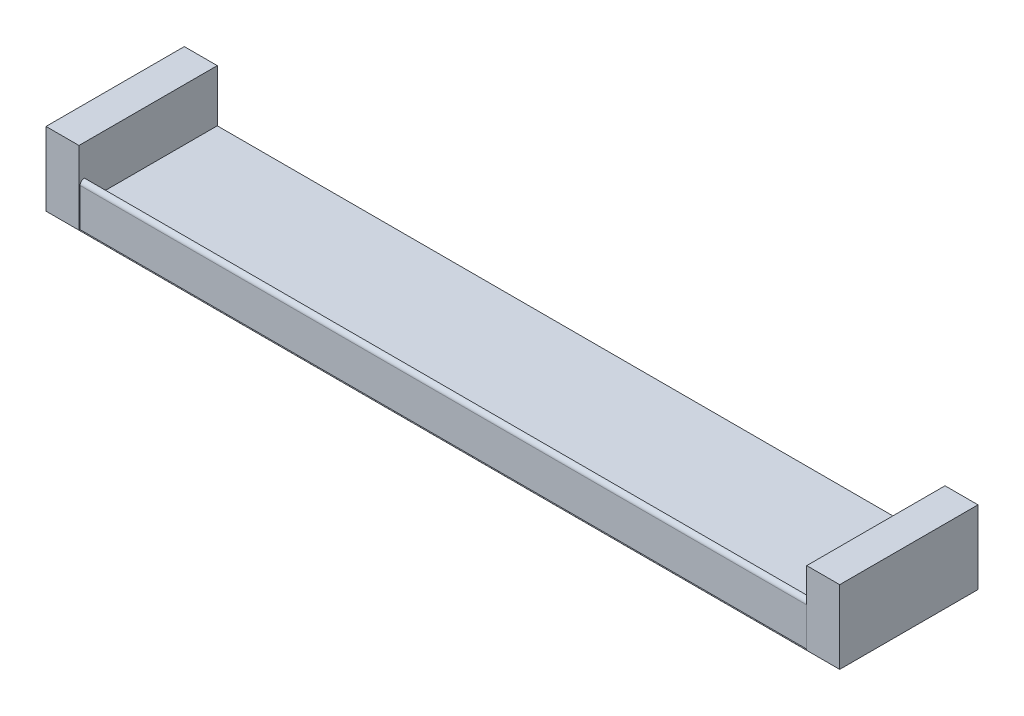
ISO-10303-21;
HEADER;
FILE_DESCRIPTION(('STEP AP214'),'2;1');
FILE_NAME('part.step','',(''),(''),'','','');
FILE_SCHEMA(('AUTOMOTIVE_DESIGN { 1 0 10303 214 1 1 1 1 }'));
ENDSEC;
DATA;
#1=APPLICATION_CONTEXT('core data for automotive mechanical design processes');
#2=APPLICATION_PROTOCOL_DEFINITION('international standard','automotive_design',2000,#1);
#3=PRODUCT_CONTEXT('',#1,'mechanical');
#4=PRODUCT('Part','Part','',(#3));
#5=PRODUCT_RELATED_PRODUCT_CATEGORY('part','',(#4));
#6=PRODUCT_DEFINITION_FORMATION('','',#4);
#7=PRODUCT_DEFINITION_CONTEXT('part definition',#1,'design');
#8=PRODUCT_DEFINITION('design','',#6,#7);
#9=PRODUCT_DEFINITION_SHAPE('','',#8);
#10=(LENGTH_UNIT() NAMED_UNIT(*) SI_UNIT(.MILLI.,.METRE.));
#11=(NAMED_UNIT(*) PLANE_ANGLE_UNIT() SI_UNIT($,.RADIAN.));
#12=(NAMED_UNIT(*) SI_UNIT($,.STERADIAN.) SOLID_ANGLE_UNIT());
#13=UNCERTAINTY_MEASURE_WITH_UNIT(LENGTH_MEASURE(1.E-05),#10,'distance_accuracy_value','');
#14=(GEOMETRIC_REPRESENTATION_CONTEXT(3) GLOBAL_UNCERTAINTY_ASSIGNED_CONTEXT((#13)) GLOBAL_UNIT_ASSIGNED_CONTEXT((#10,
#11,#12)) REPRESENTATION_CONTEXT('',''));
#15=CARTESIAN_POINT('',(0.,0.,0.));
#16=DIRECTION('',(0.,0.,1.));
#17=DIRECTION('',(1.,0.,0.));
#18=AXIS2_PLACEMENT_3D('',#15,#16,#17);
#19=CARTESIAN_POINT('',(31.,69.,0.));
#20=DIRECTION('',(-1.,0.,0.));
#21=DIRECTION('',(0.,0.,1.));
#22=AXIS2_PLACEMENT_3D('',#19,#20,#21);
#23=PLANE('',#22);
#24=DIRECTION('',(0.,-1.,0.));
#25=VECTOR('',#24,1.);
#26=CARTESIAN_POINT('',(31.,40.,-1.));
#27=LINE('',#26,#25);
#28=CARTESIAN_POINT('',(31.,36.,-1.));
#29=VERTEX_POINT('',#28);
#30=CARTESIAN_POINT('',(31.,0.0399616738491343,-1.));
#31=VERTEX_POINT('',#30);
#32=EDGE_CURVE('E121',#29,#31,#27,.T.);
#33=ORIENTED_EDGE('',*,*,#32,.F.);
#34=CARTESIAN_POINT('',(31.,36.,-5.));
#35=DIRECTION('',(-1.,0.,0.));
#36=DIRECTION('',(0.,0.,1.));
#37=AXIS2_PLACEMENT_3D('',#34,#35,#36);
#38=CIRCLE('',#37,4.);
#39=CARTESIAN_POINT('',(31.,40.,-5.));
#40=VERTEX_POINT('',#39);
#41=EDGE_CURVE('E40',#29,#40,#38,.T.);
#42=ORIENTED_EDGE('',*,*,#41,.T.);
#43=DIRECTION('',(0.,1.,0.));
#44=VECTOR('',#43,1.);
#45=CARTESIAN_POINT('',(31.,40.,-5.));
#46=LINE('',#45,#44);
#47=CARTESIAN_POINT('',(31.,20.,-5.));
#48=VERTEX_POINT('',#47);
#49=EDGE_CURVE('E155',#48,#40,#46,.T.);
#50=ORIENTED_EDGE('',*,*,#49,.F.);
#51=DIRECTION('',(0.,0.,-1.));
#52=VECTOR('',#51,1.);
#53=CARTESIAN_POINT('',(31.,20.,-5.));
#54=LINE('',#53,#52);
#55=CARTESIAN_POINT('',(31.,20.,-130.));
#56=VERTEX_POINT('',#55);
#57=EDGE_CURVE('E163',#48,#56,#54,.T.);
#58=ORIENTED_EDGE('',*,*,#57,.T.);
#59=DIRECTION('',(0.,-1.,0.));
#60=VECTOR('',#59,1.);
#61=CARTESIAN_POINT('',(31.,69.,-130.));
#62=LINE('',#61,#60);
#63=CARTESIAN_POINT('',(31.,69.,-130.));
#64=VERTEX_POINT('',#63);
#65=EDGE_CURVE('E209',#64,#56,#62,.T.);
#66=ORIENTED_EDGE('',*,*,#65,.F.);
#67=DIRECTION('',(0.,0.,-1.));
#68=VECTOR('',#67,1.);
#69=CARTESIAN_POINT('',(31.,69.,0.));
#70=LINE('',#69,#68);
#71=CARTESIAN_POINT('',(31.,69.,0.));
#72=VERTEX_POINT('',#71);
#73=EDGE_CURVE('E197',#72,#64,#70,.T.);
#74=ORIENTED_EDGE('',*,*,#73,.F.);
#75=DIRECTION('',(0.,-1.,0.));
#76=VECTOR('',#75,1.);
#77=CARTESIAN_POINT('',(31.,69.,0.));
#78=LINE('',#77,#76);
#79=CARTESIAN_POINT('',(31.,0.0399616738491343,0.));
#80=VERTEX_POINT('',#79);
#81=EDGE_CURVE('E134',#72,#80,#78,.T.);
#82=ORIENTED_EDGE('',*,*,#81,.T.);
#83=DIRECTION('',(0.,0.,1.));
#84=VECTOR('',#83,1.);
#85=CARTESIAN_POINT('',(31.,0.0399616738491343,-1.));
#86=LINE('',#85,#84);
#87=EDGE_CURVE('E131',#31,#80,#86,.T.);
#88=ORIENTED_EDGE('',*,*,#87,.F.);
#89=EDGE_LOOP('',(#33,#42,#50,#58,#66,#74,#82,#88));
#90=FACE_BOUND('',#89,.T.);
#91=ADVANCED_FACE('F32',(#90),#23,.F.);
#92=CARTESIAN_POINT('',(0.,69.,0.));
#93=DIRECTION('',(1.,0.,0.));
#94=DIRECTION('',(0.,0.,-1.));
#95=AXIS2_PLACEMENT_3D('',#92,#93,#94);
#96=PLANE('',#95);
#97=DIRECTION('',(0.,0.,1.));
#98=VECTOR('',#97,1.);
#99=CARTESIAN_POINT('',(0.,0.,0.));
#100=LINE('',#99,#98);
#101=CARTESIAN_POINT('',(0.,0.,-130.));
#102=VERTEX_POINT('',#101);
#103=CARTESIAN_POINT('',(0.,0.,0.));
#104=VERTEX_POINT('',#103);
#105=EDGE_CURVE('E190',#102,#104,#100,.T.);
#106=ORIENTED_EDGE('',*,*,#105,.T.);
#107=DIRECTION('',(0.,-1.,0.));
#108=VECTOR('',#107,1.);
#109=CARTESIAN_POINT('',(0.,69.,0.));
#110=LINE('',#109,#108);
#111=CARTESIAN_POINT('',(0.,69.,0.));
#112=VERTEX_POINT('',#111);
#113=EDGE_CURVE('E216',#112,#104,#110,.T.);
#114=ORIENTED_EDGE('',*,*,#113,.F.);
#115=DIRECTION('',(0.,0.,1.));
#116=VECTOR('',#115,1.);
#117=CARTESIAN_POINT('',(0.,69.,0.));
#118=LINE('',#117,#116);
#119=CARTESIAN_POINT('',(0.,69.,-130.));
#120=VERTEX_POINT('',#119);
#121=EDGE_CURVE('E191',#120,#112,#118,.T.);
#122=ORIENTED_EDGE('',*,*,#121,.F.);
#123=DIRECTION('',(0.,-1.,0.));
#124=VECTOR('',#123,1.);
#125=CARTESIAN_POINT('',(0.,69.,-130.));
#126=LINE('',#125,#124);
#127=EDGE_CURVE('E201',#120,#102,#126,.T.);
#128=ORIENTED_EDGE('',*,*,#127,.T.);
#129=EDGE_LOOP('',(#106,#114,#122,#128));
#130=FACE_BOUND('',#129,.T.);
#131=ADVANCED_FACE('F228',(#130),#96,.F.);
#132=CARTESIAN_POINT('',(0.,69.,0.));
#133=DIRECTION('',(0.,0.,-1.));
#134=DIRECTION('',(-1.,0.,0.));
#135=AXIS2_PLACEMENT_3D('',#132,#133,#134);
#136=PLANE('',#135);
#137=DIRECTION('',(1.,0.,0.));
#138=VECTOR('',#137,1.);
#139=CARTESIAN_POINT('',(31.,0.0399616738491343,0.));
#140=LINE('',#139,#138);
#141=CARTESIAN_POINT('',(715.,0.0399616738491343,0.));
#142=VERTEX_POINT('',#141);
#143=EDGE_CURVE('E128',#80,#142,#140,.T.);
#144=ORIENTED_EDGE('',*,*,#143,.F.);
#145=ORIENTED_EDGE('',*,*,#81,.F.);
#146=DIRECTION('',(1.,0.,0.));
#147=VECTOR('',#146,1.);
#148=CARTESIAN_POINT('',(0.,69.,0.));
#149=LINE('',#148,#147);
#150=EDGE_CURVE('E194',#112,#72,#149,.T.);
#151=ORIENTED_EDGE('',*,*,#150,.F.);
#152=ORIENTED_EDGE('',*,*,#113,.T.);
#153=DIRECTION('',(1.,0.,0.));
#154=VECTOR('',#153,1.);
#155=CARTESIAN_POINT('',(0.,0.,0.));
#156=LINE('',#155,#154);
#157=CARTESIAN_POINT('',(746.,0.,0.));
#158=VERTEX_POINT('',#157);
#159=EDGE_CURVE('E204',#104,#158,#156,.T.);
#160=ORIENTED_EDGE('',*,*,#159,.T.);
#161=DIRECTION('',(0.,-1.,0.));
#162=VECTOR('',#161,1.);
#163=CARTESIAN_POINT('',(746.,0.,0.));
#164=LINE('',#163,#162);
#165=CARTESIAN_POINT('',(746.,69.,0.));
#166=VERTEX_POINT('',#165);
#167=EDGE_CURVE('E182',#166,#158,#164,.T.);
#168=ORIENTED_EDGE('',*,*,#167,.F.);
#169=DIRECTION('',(1.,0.,0.));
#170=VECTOR('',#169,1.);
#171=CARTESIAN_POINT('',(746.,69.,0.));
#172=LINE('',#171,#170);
#173=CARTESIAN_POINT('',(715.,69.,0.));
#174=VERTEX_POINT('',#173);
#175=EDGE_CURVE('E175',#174,#166,#172,.T.);
#176=ORIENTED_EDGE('',*,*,#175,.F.);
#177=DIRECTION('',(0.,-1.,0.));
#178=VECTOR('',#177,1.);
#179=CARTESIAN_POINT('',(715.,69.,0.));
#180=LINE('',#179,#178);
#181=EDGE_CURVE('E178',#174,#142,#180,.T.);
#182=ORIENTED_EDGE('',*,*,#181,.T.);
#183=EDGE_LOOP('',(#144,#145,#151,#152,#160,#168,#176,#182));
#184=FACE_BOUND('',#183,.T.);
#185=ADVANCED_FACE('F233',(#184),#136,.F.);
#186=CARTESIAN_POINT('',(0.,69.,-130.));
#187=DIRECTION('',(0.,0.,1.));
#188=DIRECTION('',(1.,0.,0.));
#189=AXIS2_PLACEMENT_3D('',#186,#187,#188);
#190=PLANE('',#189);
#191=DIRECTION('',(-1.,0.,0.));
#192=VECTOR('',#191,1.);
#193=CARTESIAN_POINT('',(715.,20.,-130.));
#194=LINE('',#193,#192);
#195=CARTESIAN_POINT('',(715.,20.,-130.));
#196=VERTEX_POINT('',#195);
#197=EDGE_CURVE('E147',#196,#56,#194,.T.);
#198=ORIENTED_EDGE('',*,*,#197,.F.);
#199=DIRECTION('',(0.,-1.,0.));
#200=VECTOR('',#199,1.);
#201=CARTESIAN_POINT('',(715.,69.,-130.));
#202=LINE('',#201,#200);
#203=CARTESIAN_POINT('',(715.,69.,-130.));
#204=VERTEX_POINT('',#203);
#205=EDGE_CURVE('E180',#204,#196,#202,.T.);
#206=ORIENTED_EDGE('',*,*,#205,.F.);
#207=DIRECTION('',(-1.,0.,0.));
#208=VECTOR('',#207,1.);
#209=CARTESIAN_POINT('',(746.,69.,-130.));
#210=LINE('',#209,#208);
#211=CARTESIAN_POINT('',(746.,69.,-130.));
#212=VERTEX_POINT('',#211);
#213=EDGE_CURVE('E171',#212,#204,#210,.T.);
#214=ORIENTED_EDGE('',*,*,#213,.F.);
#215=DIRECTION('',(0.,1.,0.));
#216=VECTOR('',#215,1.);
#217=CARTESIAN_POINT('',(746.,0.,-130.));
#218=LINE('',#217,#216);
#219=CARTESIAN_POINT('',(746.,0.,-130.));
#220=VERTEX_POINT('',#219);
#221=EDGE_CURVE('E188',#220,#212,#218,.T.);
#222=ORIENTED_EDGE('',*,*,#221,.F.);
#223=DIRECTION('',(-1.,0.,0.));
#224=VECTOR('',#223,1.);
#225=CARTESIAN_POINT('',(0.,0.,-130.));
#226=LINE('',#225,#224);
#227=EDGE_CURVE('E195',#220,#102,#226,.T.);
#228=ORIENTED_EDGE('',*,*,#227,.T.);
#229=ORIENTED_EDGE('',*,*,#127,.F.);
#230=DIRECTION('',(-1.,0.,0.));
#231=VECTOR('',#230,1.);
#232=CARTESIAN_POINT('',(0.,69.,-130.));
#233=LINE('',#232,#231);
#234=EDGE_CURVE('E199',#64,#120,#233,.T.);
#235=ORIENTED_EDGE('',*,*,#234,.F.);
#236=ORIENTED_EDGE('',*,*,#65,.T.);
#237=EDGE_LOOP('',(#198,#206,#214,#222,#228,#229,#235,#236));
#238=FACE_BOUND('',#237,.T.);
#239=ADVANCED_FACE('F237',(#238),#190,.F.);
#240=CARTESIAN_POINT('',(0.,69.,0.));
#241=DIRECTION('',(0.,-1.,0.));
#242=DIRECTION('',(0.,0.,-1.));
#243=AXIS2_PLACEMENT_3D('',#240,#241,#242);
#244=PLANE('',#243);
#245=ORIENTED_EDGE('',*,*,#121,.T.);
#246=ORIENTED_EDGE('',*,*,#150,.T.);
#247=ORIENTED_EDGE('',*,*,#73,.T.);
#248=ORIENTED_EDGE('',*,*,#234,.T.);
#249=EDGE_LOOP('',(#245,#246,#247,#248));
#250=FACE_BOUND('',#249,.T.);
#251=ADVANCED_FACE('F244',(#250),#244,.F.);
#252=CARTESIAN_POINT('',(0.,0.,0.));
#253=DIRECTION('',(0.,-1.,0.));
#254=DIRECTION('',(0.,0.,-1.));
#255=AXIS2_PLACEMENT_3D('',#252,#253,#254);
#256=PLANE('',#255);
#257=ORIENTED_EDGE('',*,*,#105,.F.);
#258=ORIENTED_EDGE('',*,*,#227,.F.);
#259=DIRECTION('',(0.,0.,-1.));
#260=VECTOR('',#259,1.);
#261=CARTESIAN_POINT('',(746.,0.,0.));
#262=LINE('',#261,#260);
#263=EDGE_CURVE('E185',#158,#220,#262,.T.);
#264=ORIENTED_EDGE('',*,*,#263,.F.);
#265=ORIENTED_EDGE('',*,*,#159,.F.);
#266=EDGE_LOOP('',(#257,#258,#264,#265));
#267=FACE_BOUND('',#266,.T.);
#268=ADVANCED_FACE('F262',(#267),#256,.T.);
#269=CARTESIAN_POINT('',(746.,0.,0.));
#270=DIRECTION('',(-1.,0.,0.));
#271=DIRECTION('',(0.,0.,1.));
#272=AXIS2_PLACEMENT_3D('',#269,#270,#271);
#273=PLANE('',#272);
#274=ORIENTED_EDGE('',*,*,#167,.T.);
#275=ORIENTED_EDGE('',*,*,#263,.T.);
#276=ORIENTED_EDGE('',*,*,#221,.T.);
#277=DIRECTION('',(0.,0.,-1.));
#278=VECTOR('',#277,1.);
#279=CARTESIAN_POINT('',(746.,69.,0.));
#280=LINE('',#279,#278);
#281=EDGE_CURVE('E166',#166,#212,#280,.T.);
#282=ORIENTED_EDGE('',*,*,#281,.F.);
#283=EDGE_LOOP('',(#274,#275,#276,#282));
#284=FACE_BOUND('',#283,.T.);
#285=ADVANCED_FACE('F253',(#284),#273,.F.);
#286=CARTESIAN_POINT('',(715.,69.,0.));
#287=DIRECTION('',(1.,0.,0.));
#288=DIRECTION('',(0.,0.,-1.));
#289=AXIS2_PLACEMENT_3D('',#286,#287,#288);
#290=PLANE('',#289);
#291=ORIENTED_EDGE('',*,*,#205,.T.);
#292=DIRECTION('',(0.,0.,-1.));
#293=VECTOR('',#292,1.);
#294=CARTESIAN_POINT('',(715.,20.,-5.));
#295=LINE('',#294,#293);
#296=CARTESIAN_POINT('',(715.,20.,-5.));
#297=VERTEX_POINT('',#296);
#298=EDGE_CURVE('E160',#297,#196,#295,.T.);
#299=ORIENTED_EDGE('',*,*,#298,.F.);
#300=DIRECTION('',(0.,-1.,0.));
#301=VECTOR('',#300,1.);
#302=CARTESIAN_POINT('',(715.,40.,-5.));
#303=LINE('',#302,#301);
#304=CARTESIAN_POINT('',(715.,40.,-5.));
#305=VERTEX_POINT('',#304);
#306=EDGE_CURVE('E149',#305,#297,#303,.T.);
#307=ORIENTED_EDGE('',*,*,#306,.F.);
#308=CARTESIAN_POINT('',(715.,36.,-5.));
#309=DIRECTION('',(1.,0.,0.));
#310=DIRECTION('',(0.,0.,-1.));
#311=AXIS2_PLACEMENT_3D('',#308,#309,#310);
#312=CIRCLE('',#311,4.);
#313=CARTESIAN_POINT('',(715.,36.,-1.));
#314=VERTEX_POINT('',#313);
#315=EDGE_CURVE('E11',#305,#314,#312,.T.);
#316=ORIENTED_EDGE('',*,*,#315,.T.);
#317=DIRECTION('',(0.,1.,0.));
#318=VECTOR('',#317,1.);
#319=CARTESIAN_POINT('',(715.,40.,-1.));
#320=LINE('',#319,#318);
#321=CARTESIAN_POINT('',(715.,0.0399616738491343,-1.));
#322=VERTEX_POINT('',#321);
#323=EDGE_CURVE('E139',#322,#314,#320,.T.);
#324=ORIENTED_EDGE('',*,*,#323,.F.);
#325=DIRECTION('',(0.,0.,1.));
#326=VECTOR('',#325,1.);
#327=CARTESIAN_POINT('',(715.,0.0399616738491343,-1.));
#328=LINE('',#327,#326);
#329=EDGE_CURVE('E138',#322,#142,#328,.T.);
#330=ORIENTED_EDGE('',*,*,#329,.T.);
#331=ORIENTED_EDGE('',*,*,#181,.F.);
#332=DIRECTION('',(0.,0.,1.));
#333=VECTOR('',#332,1.);
#334=CARTESIAN_POINT('',(715.,69.,0.));
#335=LINE('',#334,#333);
#336=EDGE_CURVE('E173',#204,#174,#335,.T.);
#337=ORIENTED_EDGE('',*,*,#336,.F.);
#338=EDGE_LOOP('',(#291,#299,#307,#316,#324,#330,#331,#337));
#339=FACE_BOUND('',#338,.T.);
#340=ADVANCED_FACE('F249',(#339),#290,.F.);
#341=CARTESIAN_POINT('',(0.,69.,0.));
#342=DIRECTION('',(0.,1.,0.));
#343=DIRECTION('',(0.,0.,1.));
#344=AXIS2_PLACEMENT_3D('',#341,#342,#343);
#345=PLANE('',#344);
#346=ORIENTED_EDGE('',*,*,#281,.T.);
#347=ORIENTED_EDGE('',*,*,#213,.T.);
#348=ORIENTED_EDGE('',*,*,#336,.T.);
#349=ORIENTED_EDGE('',*,*,#175,.T.);
#350=EDGE_LOOP('',(#346,#347,#348,#349));
#351=FACE_BOUND('',#350,.T.);
#352=ADVANCED_FACE('F252',(#351),#345,.T.);
#353=CARTESIAN_POINT('',(715.,20.,-5.));
#354=DIRECTION('',(0.,-1.,0.));
#355=DIRECTION('',(0.,0.,-1.));
#356=AXIS2_PLACEMENT_3D('',#353,#354,#355);
#357=PLANE('',#356);
#358=ORIENTED_EDGE('',*,*,#197,.T.);
#359=ORIENTED_EDGE('',*,*,#57,.F.);
#360=DIRECTION('',(-1.,0.,0.));
#361=VECTOR('',#360,1.);
#362=CARTESIAN_POINT('',(715.,20.,-5.));
#363=LINE('',#362,#361);
#364=EDGE_CURVE('E152',#297,#48,#363,.T.);
#365=ORIENTED_EDGE('',*,*,#364,.F.);
#366=ORIENTED_EDGE('',*,*,#298,.T.);
#367=EDGE_LOOP('',(#358,#359,#365,#366));
#368=FACE_BOUND('',#367,.T.);
#369=ADVANCED_FACE('F259',(#368),#357,.F.);
#370=CARTESIAN_POINT('',(0.,0.,-5.));
#371=DIRECTION('',(0.,0.,-1.));
#372=DIRECTION('',(-1.,0.,0.));
#373=AXIS2_PLACEMENT_3D('',#370,#371,#372);
#374=PLANE('',#373);
#375=ORIENTED_EDGE('',*,*,#306,.T.);
#376=ORIENTED_EDGE('',*,*,#364,.T.);
#377=ORIENTED_EDGE('',*,*,#49,.T.);
#378=DIRECTION('',(1.,0.,0.));
#379=VECTOR('',#378,1.);
#380=CARTESIAN_POINT('',(715.,40.,-5.));
#381=LINE('',#380,#379);
#382=EDGE_CURVE('E158',#40,#305,#381,.T.);
#383=ORIENTED_EDGE('',*,*,#382,.T.);
#384=EDGE_LOOP('',(#375,#376,#377,#383));
#385=FACE_BOUND('',#384,.T.);
#386=ADVANCED_FACE('F220',(#385),#374,.T.);
#387=CARTESIAN_POINT('',(31.,0.0399616738491343,-1.));
#388=DIRECTION('',(0.,-1.,0.));
#389=DIRECTION('',(0.,0.,-1.));
#390=AXIS2_PLACEMENT_3D('',#387,#388,#389);
#391=PLANE('',#390);
#392=ORIENTED_EDGE('',*,*,#143,.T.);
#393=ORIENTED_EDGE('',*,*,#329,.F.);
#394=DIRECTION('',(1.,0.,0.));
#395=VECTOR('',#394,1.);
#396=CARTESIAN_POINT('',(31.,0.0399616738491343,-1.));
#397=LINE('',#396,#395);
#398=EDGE_CURVE('E125',#31,#322,#397,.T.);
#399=ORIENTED_EDGE('',*,*,#398,.F.);
#400=ORIENTED_EDGE('',*,*,#87,.T.);
#401=EDGE_LOOP('',(#392,#393,#399,#400));
#402=FACE_BOUND('',#401,.T.);
#403=ADVANCED_FACE('F141',(#402),#391,.F.);
#404=CARTESIAN_POINT('',(0.,0.,-1.));
#405=DIRECTION('',(0.,0.,1.));
#406=DIRECTION('',(1.,0.,0.));
#407=AXIS2_PLACEMENT_3D('',#404,#405,#406);
#408=PLANE('',#407);
#409=ORIENTED_EDGE('',*,*,#323,.T.);
#410=DIRECTION('',(-1.,0.,0.));
#411=VECTOR('',#410,1.);
#412=CARTESIAN_POINT('',(31.,36.,-1.));
#413=LINE('',#412,#411);
#414=EDGE_CURVE('E126',#314,#29,#413,.T.);
#415=ORIENTED_EDGE('',*,*,#414,.T.);
#416=ORIENTED_EDGE('',*,*,#32,.T.);
#417=ORIENTED_EDGE('',*,*,#398,.T.);
#418=EDGE_LOOP('',(#409,#415,#416,#417));
#419=FACE_BOUND('',#418,.T.);
#420=ADVANCED_FACE('F123',(#419),#408,.T.);
#421=CARTESIAN_POINT('',(0.,36.,-5.));
#422=DIRECTION('',(1.,0.,0.));
#423=DIRECTION('',(0.,0.,-1.));
#424=AXIS2_PLACEMENT_3D('',#421,#422,#423);
#425=CYLINDRICAL_SURFACE('',#424,4.);
#426=ORIENTED_EDGE('',*,*,#315,.F.);
#427=ORIENTED_EDGE('',*,*,#382,.F.);
#428=ORIENTED_EDGE('',*,*,#41,.F.);
#429=ORIENTED_EDGE('',*,*,#414,.F.);
#430=EDGE_LOOP('',(#426,#427,#428,#429));
#431=FACE_BOUND('',#430,.T.);
#432=ADVANCED_FACE('F34',(#431),#425,.T.);
#433=CLOSED_SHELL('',(#91,#131,#185,#239,#251,#268,#285,#340,#352,#369,#386,#403,#420,#432));
#434=MANIFOLD_SOLID_BREP('B2',#433);
#435=ADVANCED_BREP_SHAPE_REPRESENTATION('',(#18,#434),#14);
#436=SHAPE_DEFINITION_REPRESENTATION(#9,#435);
ENDSEC;
END-ISO-10303-21;
